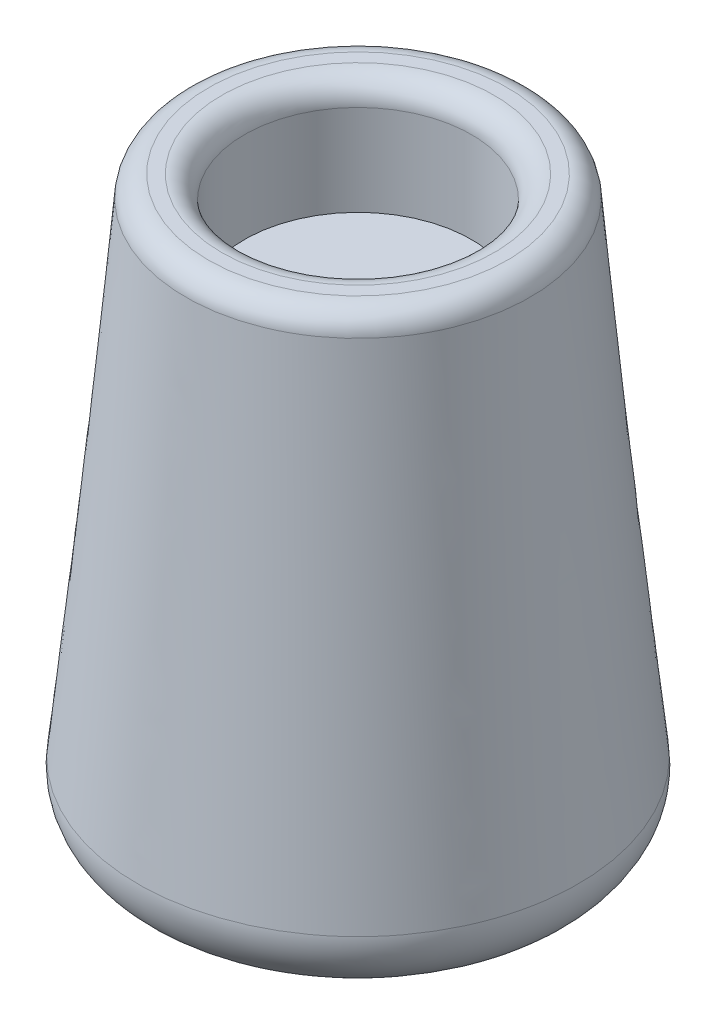
ISO-10303-21;
HEADER;
FILE_DESCRIPTION(('STEP AP214'),'2;1');
FILE_NAME('part.step','',(''),(''),'','','');
FILE_SCHEMA(('AUTOMOTIVE_DESIGN { 1 0 10303 214 1 1 1 1 }'));
ENDSEC;
DATA;
#1=APPLICATION_CONTEXT('core data for automotive mechanical design processes');
#2=APPLICATION_PROTOCOL_DEFINITION('international standard','automotive_design',2000,#1);
#3=PRODUCT_CONTEXT('',#1,'mechanical');
#4=PRODUCT('Part','Part','',(#3));
#5=PRODUCT_RELATED_PRODUCT_CATEGORY('part','',(#4));
#6=PRODUCT_DEFINITION_FORMATION('','',#4);
#7=PRODUCT_DEFINITION_CONTEXT('part definition',#1,'design');
#8=PRODUCT_DEFINITION('design','',#6,#7);
#9=PRODUCT_DEFINITION_SHAPE('','',#8);
#10=(LENGTH_UNIT() NAMED_UNIT(*) SI_UNIT(.MILLI.,.METRE.));
#11=(NAMED_UNIT(*) PLANE_ANGLE_UNIT() SI_UNIT($,.RADIAN.));
#12=(NAMED_UNIT(*) SI_UNIT($,.STERADIAN.) SOLID_ANGLE_UNIT());
#13=UNCERTAINTY_MEASURE_WITH_UNIT(LENGTH_MEASURE(1.E-05),#10,'distance_accuracy_value','');
#14=(GEOMETRIC_REPRESENTATION_CONTEXT(3) GLOBAL_UNCERTAINTY_ASSIGNED_CONTEXT((#13)) GLOBAL_UNIT_ASSIGNED_CONTEXT((#10,
#11,#12)) REPRESENTATION_CONTEXT('',''));
#15=CARTESIAN_POINT('',(0.,0.,0.));
#16=DIRECTION('',(0.,0.,1.));
#17=DIRECTION('',(1.,0.,0.));
#18=AXIS2_PLACEMENT_3D('',#15,#16,#17);
#19=CARTESIAN_POINT('',(0.,0.,0.));
#20=DIRECTION('',(0.,1.,0.));
#21=DIRECTION('',(0.,0.,1.));
#22=AXIS2_PLACEMENT_3D('',#19,#20,#21);
#23=PLANE('',#22);
#24=CARTESIAN_POINT('',(0.,0.,0.));
#25=DIRECTION('',(0.,1.,0.));
#26=DIRECTION('',(0.,0.,1.));
#27=AXIS2_PLACEMENT_3D('',#24,#25,#26);
#28=CIRCLE('',#27,14.414212316715);
#29=CARTESIAN_POINT('',(0.,0.,14.414212316715));
#30=VERTEX_POINT('',#29);
#31=EDGE_CURVE('E59',#30,#30,#28,.F.);
#32=ORIENTED_EDGE('',*,*,#31,.T.);
#33=EDGE_LOOP('',(#32));
#34=FACE_BOUND('',#33,.T.);
#35=ADVANCED_FACE('F39',(#34),#23,.F.);
#36=CARTESIAN_POINT('',(0.,50.,0.));
#37=DIRECTION('',(0.,1.,0.));
#38=DIRECTION('',(0.,0.,1.));
#39=AXIS2_PLACEMENT_3D('',#36,#37,#38);
#40=PLANE('',#39);
#41=CARTESIAN_POINT('',(0.,50.,0.));
#42=DIRECTION('',(0.,1.,0.));
#43=DIRECTION('',(0.,0.,1.));
#44=AXIS2_PLACEMENT_3D('',#41,#42,#43);
#45=CIRCLE('',#44,13.1622821239771);
#46=CARTESIAN_POINT('',(0.,50.,13.1622821239771));
#47=VERTEX_POINT('',#46);
#48=EDGE_CURVE('E50',#47,#47,#45,.T.);
#49=ORIENTED_EDGE('',*,*,#48,.T.);
#50=EDGE_LOOP('',(#49));
#51=FACE_BOUND('',#50,.T.);
#52=CARTESIAN_POINT('',(0.,50.,0.));
#53=DIRECTION('',(0.,1.,0.));
#54=DIRECTION('',(0.,0.,1.));
#55=AXIS2_PLACEMENT_3D('',#52,#53,#54);
#56=CIRCLE('',#55,12.);
#57=CARTESIAN_POINT('',(0.,50.,12.));
#58=VERTEX_POINT('',#57);
#59=EDGE_CURVE('E54',#58,#58,#56,.F.);
#60=ORIENTED_EDGE('',*,*,#59,.T.);
#61=EDGE_LOOP('',(#60));
#62=FACE_BOUND('',#61,.T.);
#63=ADVANCED_FACE('F82',(#51,#62),#40,.T.);
#64=CARTESIAN_POINT('',(-10.4939721083959,50.,-10.7180478347602));
#65=CARTESIAN_POINT('',(-17.4367938530436,0.,-9.79582666886571));
#66=CARTESIAN_POINT('',(10.9421235611245,50.,-31.7059920515521));
#67=CARTESIAN_POINT('',(2.15485948468781,0.,-44.6694143749529));
#68=CARTESIAN_POINT('',(31.9300677779164,50.,-10.2698963820317));
#69=CARTESIAN_POINT('',(37.028447190775,0.,-25.0777610372215));
#70=CARTESIAN_POINT('',(10.4939721083959,50.,10.7180478347602));
#71=CARTESIAN_POINT('',(17.4367938530436,0.,9.79582666886571));
#72=CARTESIAN_POINT('',(-10.9421235611245,50.,31.7059920515521));
#73=CARTESIAN_POINT('',(-2.1548594846878,0.,44.6694143749529));
#74=CARTESIAN_POINT('',(-31.9300677779164,50.,10.2698963820317));
#75=CARTESIAN_POINT('',(-37.028447190775,0.,25.0777610372215));
#76=CARTESIAN_POINT('',(-10.4939721083959,50.,-10.7180478347602));
#77=CARTESIAN_POINT('',(-17.4367938530436,0.,-9.79582666886571));
#78=(BOUNDED_SURFACE() B_SPLINE_SURFACE(3,1,((#64,#65),(#66,#67),(#68,#69),(#70,#71),(#72,#73),
(#74,#75),(#76,#77)),.UNSPECIFIED.,.T.,.F.,.F.) B_SPLINE_SURFACE_WITH_KNOTS((4,3,4),(2,2),(0.,
0.5,1.),(0.,1.),.UNSPECIFIED.) GEOMETRIC_REPRESENTATION_ITEM() RATIONAL_B_SPLINE_SURFACE(((1.,
1.),(0.333333333333333,0.333333333333333),(0.333333333333333,0.333333333333333),(1.,1.),
(0.333333333333333,0.333333333333333),(0.333333333333333,0.333333333333333),(1.,1.))) REPRESENTATION_ITEM('') SURFACE());
#79=CARTESIAN_POINT('',(0.,48.1703279965649,0.));
#80=DIRECTION('',(0.,-1.,0.));
#81=DIRECTION('',(0.,0.,-1.));
#82=AXIS2_PLACEMENT_3D('',#79,#80,#81);
#83=CIRCLE('',#82,15.1550160183008);
#84=CARTESIAN_POINT('',(-10.7480338398164,48.1703279965649,-10.684300589796));
#85=VERTEX_POINT('',#84);
#86=EDGE_CURVE('E46',#85,#85,#83,.T.);
#87=CARTESIAN_POINT('',(0.,5.54655912134601,0.));
#88=DIRECTION('',(0.,-1.,0.));
#89=DIRECTION('',(0.,0.,-1.));
#90=AXIS2_PLACEMENT_3D('',#87,#88,#89);
#91=CIRCLE('',#90,19.3842498544881);
#92=CARTESIAN_POINT('',(-16.6666184275305,5.54655912134601,-9.89812975325752));
#93=VERTEX_POINT('',#92);
#94=EDGE_CURVE('E62',#93,#93,#91,.F.);
#95=CARTESIAN_POINT('',(-10.7480338398164,48.1703279965649,-10.684300589796));
#96=CARTESIAN_POINT('',(-10.8096857626051,47.7263304041147,-10.6761113102487));
#97=CARTESIAN_POINT('',(-10.8713376853938,47.2823328116645,-10.6679220307014));
#98=CARTESIAN_POINT('',(-10.9946415309711,46.3943376267641,-10.6515434716069));
#99=CARTESIAN_POINT('',(-11.0562934537598,45.9503400343139,-10.6433541920596));
#100=CARTESIAN_POINT('',(-11.1795972993372,45.0623448494135,-10.626975632965));
#101=CARTESIAN_POINT('',(-11.2412492221259,44.6183472569633,-10.6187863534178));
#102=CARTESIAN_POINT('',(-11.3645530677033,43.7303520720629,-10.6024077943232));
#103=CARTESIAN_POINT('',(-11.426204990492,43.2863544796127,-10.5942185147759));
#104=CARTESIAN_POINT('',(-11.5495088360693,42.3983592947123,-10.5778399556814));
#105=CARTESIAN_POINT('',(-11.611160758858,41.9543617022621,-10.5696506761341));
#106=CARTESIAN_POINT('',(-11.7344646044354,41.0663665173617,-10.5532721170396));
#107=CARTESIAN_POINT('',(-11.7961165272241,40.6223689249115,-10.5450828374923));
#108=CARTESIAN_POINT('',(-11.9194203728015,39.7343737400112,-10.5287042783977));
#109=CARTESIAN_POINT('',(-11.9810722955902,39.290376147561,-10.5205149988505));
#110=CARTESIAN_POINT('',(-12.1043761411675,38.4023809626606,-10.5041364397559));
#111=CARTESIAN_POINT('',(-12.1660280639562,37.9583833702104,-10.4959471602086));
#112=CARTESIAN_POINT('',(-12.2893319095336,37.07038818531,-10.4795686011141));
#113=CARTESIAN_POINT('',(-12.3509838323223,36.6263905928598,-10.4713793215668));
#114=CARTESIAN_POINT('',(-12.4742876778997,35.7383954079594,-10.4550007624723));
#115=CARTESIAN_POINT('',(-12.5359396006884,35.2943978155092,-10.446811482925));
#116=CARTESIAN_POINT('',(-12.6592434462657,34.4064026306088,-10.4304329238304));
#117=CARTESIAN_POINT('',(-12.7208953690544,33.9624050381586,-10.4222436442831));
#118=CARTESIAN_POINT('',(-12.8441992146318,33.0744098532582,-10.4058650851886));
#119=CARTESIAN_POINT('',(-12.9058511374205,32.630412260808,-10.3976758056413));
#120=CARTESIAN_POINT('',(-13.0291549829979,31.7424170759076,-10.3812972465468));
#121=CARTESIAN_POINT('',(-13.0908069057866,31.2984194834574,-10.3731079669995));
#122=CARTESIAN_POINT('',(-13.2141107513639,30.410424298557,-10.3567294079049));
#123=CARTESIAN_POINT('',(-13.2757626741526,29.9664267061068,-10.3485401283577));
#124=CARTESIAN_POINT('',(-13.39906651973,29.0784315212064,-10.3321615692631));
#125=CARTESIAN_POINT('',(-13.4607184425187,28.6344339287562,-10.3239722897158));
#126=CARTESIAN_POINT('',(-13.5840222880961,27.7464387438558,-10.3075937306213));
#127=CARTESIAN_POINT('',(-13.6456742108848,27.3024411514056,-10.299404451074));
#128=CARTESIAN_POINT('',(-13.7689780564621,26.4144459665053,-10.2830258919795));
#129=CARTESIAN_POINT('',(-13.8306299792508,25.9704483740551,-10.2748366124322));
#130=CARTESIAN_POINT('',(-13.9539338248282,25.0824531891547,-10.2584580533376));
#131=CARTESIAN_POINT('',(-14.0155857476169,24.6384555967045,-10.2502687737904));
#132=CARTESIAN_POINT('',(-14.1388895931943,23.7504604118041,-10.2338902146958));
#133=CARTESIAN_POINT('',(-14.200541515983,23.3064628193539,-10.2257009351485));
#134=CARTESIAN_POINT('',(-14.3238453615603,22.4184676344535,-10.209322376054));
#135=CARTESIAN_POINT('',(-14.385497284349,21.9744700420033,-10.2011330965067));
#136=CARTESIAN_POINT('',(-14.5088011299264,21.0864748571029,-10.1847545374122));
#137=CARTESIAN_POINT('',(-14.5704530527151,20.6424772646527,-10.1765652578649));
#138=CARTESIAN_POINT('',(-14.6937568982925,19.7544820797523,-10.1601866987703));
#139=CARTESIAN_POINT('',(-14.7554088210812,19.3104844873021,-10.1519974192231));
#140=CARTESIAN_POINT('',(-14.8787126666585,18.4224893024017,-10.1356188601285));
#141=CARTESIAN_POINT('',(-14.9403645894472,17.9784917099515,-10.1274295805812));
#142=CARTESIAN_POINT('',(-15.0636684350246,17.0904965250511,-10.1110510214867));
#143=CARTESIAN_POINT('',(-15.1253203578133,16.6464989326009,-10.1028617419394));
#144=CARTESIAN_POINT('',(-15.2486242033907,15.7585037477005,-10.0864831828449));
#145=CARTESIAN_POINT('',(-15.3102761261794,15.3145061552503,-10.0782939032976));
#146=CARTESIAN_POINT('',(-15.4335799717567,14.4265109703499,-10.061915344203));
#147=CARTESIAN_POINT('',(-15.4952318945454,13.9825133778997,-10.0537260646558));
#148=CARTESIAN_POINT('',(-15.6185357401228,13.0945181929994,-10.0373475055612));
#149=CARTESIAN_POINT('',(-15.6801876629115,12.6505206005492,-10.0291582260139));
#150=CARTESIAN_POINT('',(-15.8034915084889,11.7625254156488,-10.0127796669194));
#151=CARTESIAN_POINT('',(-15.8651434312776,11.3185278231986,-10.0045903873721));
#152=CARTESIAN_POINT('',(-15.9884472768549,10.4305326382982,-9.98821182827755));
#153=CARTESIAN_POINT('',(-16.0500991996436,9.98653504584798,-9.98002254873028));
#154=CARTESIAN_POINT('',(-16.173403045221,9.09853986094759,-9.96364398963573));
#155=CARTESIAN_POINT('',(-16.2350549680097,8.65454226849739,-9.95545471008845));
#156=CARTESIAN_POINT('',(-16.3583588135871,7.76654708359699,-9.9390761509939));
#157=CARTESIAN_POINT('',(-16.4200107363758,7.32254949114679,-9.93088687144662));
#158=CARTESIAN_POINT('',(-16.5433145819531,6.4345543062464,-9.91450831235207));
#159=CARTESIAN_POINT('',(-16.6049665047418,5.9905567137962,-9.9063190328048));
#160=CARTESIAN_POINT('',(-16.6666184275305,5.54655912134601,-9.89812975325752));
#161=B_SPLINE_CURVE_WITH_KNOTS('',3,(#95,#96,#97,#98,#99,#100,#101,#102,#103,#104,#105,#106,
#107,#108,#109,#110,#111,#112,#113,#114,#115,#116,#117,#118,#119,#120,#121,#122,#123,#124,#125,
#126,#127,#128,#129,#130,#131,#132,#133,#134,#135,#136,#137,#138,#139,#140,#141,#142,#143,#144,
#145,#146,#147,#148,#149,#150,#151,#152,#153,#154,#155,#156,#157,#158,#159,#160),.UNSPECIFIED.,
.F.,.F.,(4,2,2,2,2,2,2,2,2,2,2,2,2,2,2,2,2,2,2,2,2,2,2,2,2,2,2,2,2,2,2,2,4),(0.,1.3449970163021,
2.68999403260419,4.0349910489063,5.3799880652084,6.7249850815105,8.0699820978126,
9.4149791141147,10.7599761304168,12.1049731467189,13.449970163021,14.7949671793231,
16.1399641956252,17.4849612119273,18.8299582282294,20.1749552445315,21.5199522608336,
22.8649492771357,24.2099462934378,25.5549433097399,26.899940326042,28.2449373423441,
29.5899343586462,30.9349313749483,32.2799283912504,33.6249254075525,34.9699224238546,
36.3149194401567,37.6599164564588,39.0049134727609,40.349910489063,41.6949075053651,
43.0399045216672),.UNSPECIFIED.);
#162=EDGE_CURVE('BSEAM73',#85,#93,#161,.T.);
#163=ORIENTED_EDGE('',*,*,#86,.T.);
#164=ORIENTED_EDGE('',*,*,#94,.T.);
#165=ORIENTED_EDGE('',*,*,#162,.T.);
#166=ORIENTED_EDGE('',*,*,#162,.F.);
#167=EDGE_LOOP('',(#163,#165,#164,#166));
#168=FACE_BOUND('',#167,.T.);
#169=ADVANCED_FACE('F73',(#168),#78,.T.);
#170=CARTESIAN_POINT('',(0.,50.0001,0.));
#171=DIRECTION('',(0.,-1.,0.));
#172=DIRECTION('',(0.,0.,-1.));
#173=AXIS2_PLACEMENT_3D('',#170,#171,#172);
#174=CYLINDRICAL_SURFACE('',#173,10.);
#175=CARTESIAN_POINT('',(0.,48.,0.));
#176=DIRECTION('',(0.,1.,0.));
#177=DIRECTION('',(0.,0.,1.));
#178=AXIS2_PLACEMENT_3D('',#175,#176,#177);
#179=CIRCLE('',#178,10.);
#180=CARTESIAN_POINT('',(0.,48.,10.));
#181=VERTEX_POINT('',#180);
#182=EDGE_CURVE('E11',#181,#181,#179,.T.);
#183=ORIENTED_EDGE('',*,*,#182,.T.);
#184=EDGE_LOOP('',(#183));
#185=FACE_BOUND('',#184,.T.);
#186=CARTESIAN_POINT('',(0.,40.,0.));
#187=DIRECTION('',(0.,1.,0.));
#188=DIRECTION('',(0.,0.,1.));
#189=AXIS2_PLACEMENT_3D('',#186,#187,#188);
#190=CIRCLE('',#189,10.);
#191=CARTESIAN_POINT('',(0.,40.,10.));
#192=VERTEX_POINT('',#191);
#193=EDGE_CURVE('E65',#192,#192,#190,.T.);
#194=ORIENTED_EDGE('',*,*,#193,.F.);
#195=EDGE_LOOP('',(#194));
#196=FACE_BOUND('',#195,.T.);
#197=ADVANCED_FACE('F71',(#185,#196),#174,.F.);
#198=CARTESIAN_POINT('',(0.,40.,0.));
#199=DIRECTION('',(0.,1.,0.));
#200=DIRECTION('',(0.,0.,1.));
#201=AXIS2_PLACEMENT_3D('',#198,#199,#200);
#202=PLANE('',#201);
#203=ORIENTED_EDGE('',*,*,#193,.T.);
#204=EDGE_LOOP('',(#203));
#205=FACE_BOUND('',#204,.T.);
#206=ADVANCED_FACE('F69',(#205),#202,.T.);
#207=CARTESIAN_POINT('',(0.,5.,0.));
#208=DIRECTION('',(0.,-1.,0.));
#209=DIRECTION('',(0.,0.,-1.));
#210=AXIS2_PLACEMENT_3D('',#207,#208,#209);
#211=TOROIDAL_SURFACE('',#210,14.414212316715,5.);
#212=ORIENTED_EDGE('',*,*,#31,.F.);
#213=EDGE_LOOP('',(#212));
#214=FACE_BOUND('',#213,.T.);
#215=ORIENTED_EDGE('',*,*,#94,.F.);
#216=EDGE_LOOP('',(#215));
#217=FACE_BOUND('',#216,.T.);
#218=ADVANCED_FACE('F80',(#214,#217),#211,.T.);
#219=CARTESIAN_POINT('',(0.,48.,0.));
#220=DIRECTION('',(0.,-1.,0.));
#221=DIRECTION('',(0.,0.,-1.));
#222=AXIS2_PLACEMENT_3D('',#219,#220,#221);
#223=TOROIDAL_SURFACE('',#222,13.1622821239771,2.);
#224=ORIENTED_EDGE('',*,*,#86,.F.);
#225=EDGE_LOOP('',(#224));
#226=FACE_BOUND('',#225,.T.);
#227=ORIENTED_EDGE('',*,*,#48,.F.);
#228=EDGE_LOOP('',(#227));
#229=FACE_BOUND('',#228,.T.);
#230=ADVANCED_FACE('F96',(#226,#229),#223,.T.);
#231=CARTESIAN_POINT('',(0.,48.,0.));
#232=DIRECTION('',(0.,1.,0.));
#233=DIRECTION('',(0.,0.,1.));
#234=AXIS2_PLACEMENT_3D('',#231,#232,#233);
#235=TOROIDAL_SURFACE('',#234,12.,2.);
#236=ORIENTED_EDGE('',*,*,#182,.F.);
#237=EDGE_LOOP('',(#236));
#238=FACE_BOUND('',#237,.T.);
#239=ORIENTED_EDGE('',*,*,#59,.F.);
#240=EDGE_LOOP('',(#239));
#241=FACE_BOUND('',#240,.T.);
#242=ADVANCED_FACE('F41',(#238,#241),#235,.T.);
#243=CLOSED_SHELL('',(#35,#63,#169,#197,#206,#218,#230,#242));
#244=MANIFOLD_SOLID_BREP('B2',#243);
#245=ADVANCED_BREP_SHAPE_REPRESENTATION('',(#18,#244),#14);
#246=SHAPE_DEFINITION_REPRESENTATION(#9,#245);
ENDSEC;
END-ISO-10303-21;
